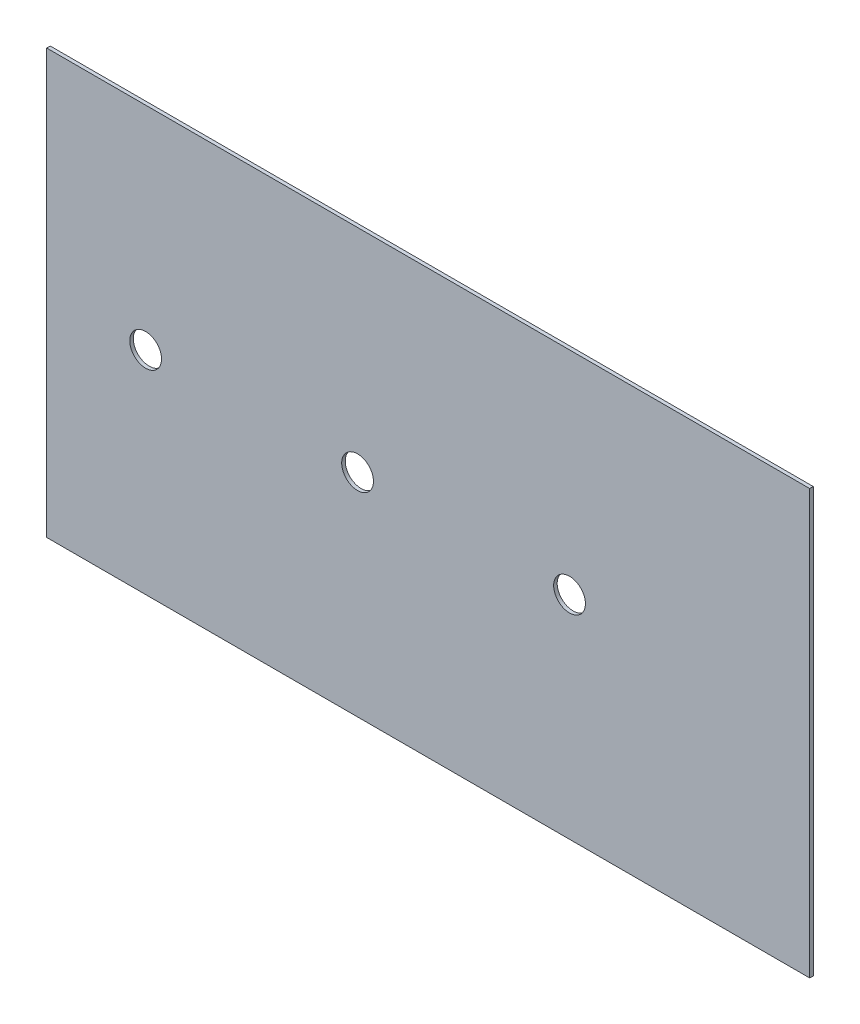
ISO-10303-21;
HEADER;
FILE_DESCRIPTION(('STEP AP214'),'2;1');
FILE_NAME('part.step','',(''),(''),'','','');
FILE_SCHEMA(('AUTOMOTIVE_DESIGN { 1 0 10303 214 1 1 1 1 }'));
ENDSEC;
DATA;
#1=APPLICATION_CONTEXT('core data for automotive mechanical design processes');
#2=APPLICATION_PROTOCOL_DEFINITION('international standard','automotive_design',2000,#1);
#3=PRODUCT_CONTEXT('',#1,'mechanical');
#4=PRODUCT('Part','Part','',(#3));
#5=PRODUCT_RELATED_PRODUCT_CATEGORY('part','',(#4));
#6=PRODUCT_DEFINITION_FORMATION('','',#4);
#7=PRODUCT_DEFINITION_CONTEXT('part definition',#1,'design');
#8=PRODUCT_DEFINITION('design','',#6,#7);
#9=PRODUCT_DEFINITION_SHAPE('','',#8);
#10=(LENGTH_UNIT() NAMED_UNIT(*) SI_UNIT(.MILLI.,.METRE.));
#11=(NAMED_UNIT(*) PLANE_ANGLE_UNIT() SI_UNIT($,.RADIAN.));
#12=(NAMED_UNIT(*) SI_UNIT($,.STERADIAN.) SOLID_ANGLE_UNIT());
#13=UNCERTAINTY_MEASURE_WITH_UNIT(LENGTH_MEASURE(1.E-05),#10,'distance_accuracy_value','');
#14=(GEOMETRIC_REPRESENTATION_CONTEXT(3) GLOBAL_UNCERTAINTY_ASSIGNED_CONTEXT((#13)) GLOBAL_UNIT_ASSIGNED_CONTEXT((#10,
#11,#12)) REPRESENTATION_CONTEXT('',''));
#15=CARTESIAN_POINT('',(0.,0.,0.));
#16=DIRECTION('',(0.,0.,1.));
#17=DIRECTION('',(1.,0.,0.));
#18=AXIS2_PLACEMENT_3D('',#15,#16,#17);
#19=CARTESIAN_POINT('',(0.,0.,3.175));
#20=DIRECTION('',(1.,0.,0.));
#21=DIRECTION('',(0.,0.,-1.));
#22=AXIS2_PLACEMENT_3D('',#19,#20,#21);
#23=PLANE('',#22);
#24=DIRECTION('',(0.,-1.,0.));
#25=VECTOR('',#24,1.);
#26=CARTESIAN_POINT('',(0.,0.,0.));
#27=LINE('',#26,#25);
#28=CARTESIAN_POINT('',(0.,381.,0.));
#29=VERTEX_POINT('',#28);
#30=CARTESIAN_POINT('',(0.,0.,0.));
#31=VERTEX_POINT('',#30);
#32=EDGE_CURVE('E106',#29,#31,#27,.T.);
#33=ORIENTED_EDGE('',*,*,#32,.T.);
#34=DIRECTION('',(0.,0.,-1.));
#35=VECTOR('',#34,1.);
#36=CARTESIAN_POINT('',(0.,0.,3.175));
#37=LINE('',#36,#35);
#38=CARTESIAN_POINT('',(0.,0.,3.175));
#39=VERTEX_POINT('',#38);
#40=EDGE_CURVE('E11',#39,#31,#37,.T.);
#41=ORIENTED_EDGE('',*,*,#40,.F.);
#42=DIRECTION('',(0.,-1.,0.));
#43=VECTOR('',#42,1.);
#44=CARTESIAN_POINT('',(0.,0.,3.175));
#45=LINE('',#44,#43);
#46=CARTESIAN_POINT('',(0.,381.,3.175));
#47=VERTEX_POINT('',#46);
#48=EDGE_CURVE('E90',#47,#39,#45,.T.);
#49=ORIENTED_EDGE('',*,*,#48,.F.);
#50=DIRECTION('',(0.,0.,-1.));
#51=VECTOR('',#50,1.);
#52=CARTESIAN_POINT('',(0.,381.,3.175));
#53=LINE('',#52,#51);
#54=EDGE_CURVE('E102',#47,#29,#53,.T.);
#55=ORIENTED_EDGE('',*,*,#54,.T.);
#56=EDGE_LOOP('',(#33,#41,#49,#55));
#57=FACE_BOUND('',#56,.T.);
#58=ADVANCED_FACE('F38',(#57),#23,.F.);
#59=CARTESIAN_POINT('',(0.,0.,3.175));
#60=DIRECTION('',(0.,1.,0.));
#61=DIRECTION('',(0.,0.,1.));
#62=AXIS2_PLACEMENT_3D('',#59,#60,#61);
#63=PLANE('',#62);
#64=DIRECTION('',(1.,0.,0.));
#65=VECTOR('',#64,1.);
#66=CARTESIAN_POINT('',(0.,0.,0.));
#67=LINE('',#66,#65);
#68=CARTESIAN_POINT('',(685.8,0.,0.));
#69=VERTEX_POINT('',#68);
#70=EDGE_CURVE('E95',#31,#69,#67,.T.);
#71=ORIENTED_EDGE('',*,*,#70,.T.);
#72=DIRECTION('',(0.,0.,-1.));
#73=VECTOR('',#72,1.);
#74=CARTESIAN_POINT('',(685.8,0.,3.175));
#75=LINE('',#74,#73);
#76=CARTESIAN_POINT('',(685.8,0.,3.175));
#77=VERTEX_POINT('',#76);
#78=EDGE_CURVE('E47',#77,#69,#75,.T.);
#79=ORIENTED_EDGE('',*,*,#78,.F.);
#80=DIRECTION('',(1.,0.,0.));
#81=VECTOR('',#80,1.);
#82=CARTESIAN_POINT('',(0.,0.,3.175));
#83=LINE('',#82,#81);
#84=EDGE_CURVE('E85',#39,#77,#83,.T.);
#85=ORIENTED_EDGE('',*,*,#84,.F.);
#86=ORIENTED_EDGE('',*,*,#40,.T.);
#87=EDGE_LOOP('',(#71,#79,#85,#86));
#88=FACE_BOUND('',#87,.T.);
#89=ADVANCED_FACE('F94',(#88),#63,.F.);
#90=CARTESIAN_POINT('',(685.8,0.,3.175));
#91=DIRECTION('',(-1.,0.,0.));
#92=DIRECTION('',(0.,0.,1.));
#93=AXIS2_PLACEMENT_3D('',#90,#91,#92);
#94=PLANE('',#93);
#95=DIRECTION('',(0.,1.,0.));
#96=VECTOR('',#95,1.);
#97=CARTESIAN_POINT('',(685.8,0.,0.));
#98=LINE('',#97,#96);
#99=CARTESIAN_POINT('',(685.8,381.,0.));
#100=VERTEX_POINT('',#99);
#101=EDGE_CURVE('E72',#69,#100,#98,.T.);
#102=ORIENTED_EDGE('',*,*,#101,.T.);
#103=DIRECTION('',(0.,0.,-1.));
#104=VECTOR('',#103,1.);
#105=CARTESIAN_POINT('',(685.8,381.,3.175));
#106=LINE('',#105,#104);
#107=CARTESIAN_POINT('',(685.8,381.,3.175));
#108=VERTEX_POINT('',#107);
#109=EDGE_CURVE('E97',#108,#100,#106,.T.);
#110=ORIENTED_EDGE('',*,*,#109,.F.);
#111=DIRECTION('',(0.,1.,0.));
#112=VECTOR('',#111,1.);
#113=CARTESIAN_POINT('',(685.8,0.,3.175));
#114=LINE('',#113,#112);
#115=EDGE_CURVE('E88',#77,#108,#114,.T.);
#116=ORIENTED_EDGE('',*,*,#115,.F.);
#117=ORIENTED_EDGE('',*,*,#78,.T.);
#118=EDGE_LOOP('',(#102,#110,#116,#117));
#119=FACE_BOUND('',#118,.T.);
#120=ADVANCED_FACE('F98',(#119),#94,.F.);
#121=CARTESIAN_POINT('',(0.,381.,3.175));
#122=DIRECTION('',(0.,-1.,0.));
#123=DIRECTION('',(0.,0.,-1.));
#124=AXIS2_PLACEMENT_3D('',#121,#122,#123);
#125=PLANE('',#124);
#126=DIRECTION('',(-1.,0.,0.));
#127=VECTOR('',#126,1.);
#128=CARTESIAN_POINT('',(0.,381.,0.));
#129=LINE('',#128,#127);
#130=EDGE_CURVE('E78',#100,#29,#129,.T.);
#131=ORIENTED_EDGE('',*,*,#130,.T.);
#132=ORIENTED_EDGE('',*,*,#54,.F.);
#133=DIRECTION('',(-1.,0.,0.));
#134=VECTOR('',#133,1.);
#135=CARTESIAN_POINT('',(0.,381.,3.175));
#136=LINE('',#135,#134);
#137=EDGE_CURVE('E55',#108,#47,#136,.T.);
#138=ORIENTED_EDGE('',*,*,#137,.F.);
#139=ORIENTED_EDGE('',*,*,#109,.T.);
#140=EDGE_LOOP('',(#131,#132,#138,#139));
#141=FACE_BOUND('',#140,.T.);
#142=ADVANCED_FACE('F120',(#141),#125,.F.);
#143=CARTESIAN_POINT('',(0.,0.,3.175));
#144=DIRECTION('',(0.,0.,-1.));
#145=DIRECTION('',(-1.,0.,0.));
#146=AXIS2_PLACEMENT_3D('',#143,#144,#145);
#147=PLANE('',#146);
#148=CARTESIAN_POINT('',(88.9,190.5,3.175));
#149=DIRECTION('',(0.,0.,1.));
#150=DIRECTION('',(1.,0.,0.));
#151=AXIS2_PLACEMENT_3D('',#148,#149,#150);
#152=CIRCLE('',#151,14.2875);
#153=CARTESIAN_POINT('',(103.1875,190.5,3.175));
#154=VERTEX_POINT('',#153);
#155=EDGE_CURVE('E143',#154,#154,#152,.T.);
#156=ORIENTED_EDGE('',*,*,#155,.F.);
#157=EDGE_LOOP('',(#156));
#158=FACE_BOUND('',#157,.T.);
#159=CARTESIAN_POINT('',(279.4,190.5,3.175));
#160=DIRECTION('',(0.,0.,1.));
#161=DIRECTION('',(1.,0.,0.));
#162=AXIS2_PLACEMENT_3D('',#159,#160,#161);
#163=CIRCLE('',#162,14.2875);
#164=CARTESIAN_POINT('',(293.6875,190.5,3.175));
#165=VERTEX_POINT('',#164);
#166=EDGE_CURVE('E139',#165,#165,#163,.T.);
#167=ORIENTED_EDGE('',*,*,#166,.F.);
#168=EDGE_LOOP('',(#167));
#169=FACE_BOUND('',#168,.T.);
#170=CARTESIAN_POINT('',(469.9,190.5,3.175));
#171=DIRECTION('',(0.,0.,1.));
#172=DIRECTION('',(1.,0.,0.));
#173=AXIS2_PLACEMENT_3D('',#170,#171,#172);
#174=CIRCLE('',#173,14.2875);
#175=CARTESIAN_POINT('',(484.1875,190.5,3.175));
#176=VERTEX_POINT('',#175);
#177=EDGE_CURVE('E131',#176,#176,#174,.T.);
#178=ORIENTED_EDGE('',*,*,#177,.F.);
#179=EDGE_LOOP('',(#178));
#180=FACE_BOUND('',#179,.T.);
#181=ORIENTED_EDGE('',*,*,#48,.T.);
#182=ORIENTED_EDGE('',*,*,#84,.T.);
#183=ORIENTED_EDGE('',*,*,#115,.T.);
#184=ORIENTED_EDGE('',*,*,#137,.T.);
#185=EDGE_LOOP('',(#181,#182,#183,#184));
#186=FACE_BOUND('',#185,.T.);
#187=ADVANCED_FACE('F86',(#158,#169,#180,#186),#147,.F.);
#188=CARTESIAN_POINT('',(0.,0.,0.));
#189=DIRECTION('',(0.,0.,-1.));
#190=DIRECTION('',(-1.,0.,0.));
#191=AXIS2_PLACEMENT_3D('',#188,#189,#190);
#192=PLANE('',#191);
#193=CARTESIAN_POINT('',(88.9,190.5,0.));
#194=DIRECTION('',(0.,0.,1.));
#195=DIRECTION('',(1.,0.,0.));
#196=AXIS2_PLACEMENT_3D('',#193,#194,#195);
#197=CIRCLE('',#196,14.2875);
#198=CARTESIAN_POINT('',(103.1875,190.5,0.));
#199=VERTEX_POINT('',#198);
#200=EDGE_CURVE('E110',#199,#199,#197,.T.);
#201=ORIENTED_EDGE('',*,*,#200,.T.);
#202=EDGE_LOOP('',(#201));
#203=FACE_BOUND('',#202,.T.);
#204=CARTESIAN_POINT('',(279.4,190.5,0.));
#205=DIRECTION('',(0.,0.,1.));
#206=DIRECTION('',(1.,0.,0.));
#207=AXIS2_PLACEMENT_3D('',#204,#205,#206);
#208=CIRCLE('',#207,14.2875);
#209=CARTESIAN_POINT('',(293.6875,190.5,0.));
#210=VERTEX_POINT('',#209);
#211=EDGE_CURVE('E135',#210,#210,#208,.T.);
#212=ORIENTED_EDGE('',*,*,#211,.T.);
#213=EDGE_LOOP('',(#212));
#214=FACE_BOUND('',#213,.T.);
#215=CARTESIAN_POINT('',(469.9,190.5,0.));
#216=DIRECTION('',(0.,0.,1.));
#217=DIRECTION('',(1.,0.,0.));
#218=AXIS2_PLACEMENT_3D('',#215,#216,#217);
#219=CIRCLE('',#218,14.2875);
#220=CARTESIAN_POINT('',(484.1875,190.5,0.));
#221=VERTEX_POINT('',#220);
#222=EDGE_CURVE('E127',#221,#221,#219,.T.);
#223=ORIENTED_EDGE('',*,*,#222,.T.);
#224=EDGE_LOOP('',(#223));
#225=FACE_BOUND('',#224,.T.);
#226=ORIENTED_EDGE('',*,*,#32,.F.);
#227=ORIENTED_EDGE('',*,*,#130,.F.);
#228=ORIENTED_EDGE('',*,*,#101,.F.);
#229=ORIENTED_EDGE('',*,*,#70,.F.);
#230=EDGE_LOOP('',(#226,#227,#228,#229));
#231=FACE_BOUND('',#230,.T.);
#232=ADVANCED_FACE('F123',(#203,#214,#225,#231),#192,.T.);
#233=CARTESIAN_POINT('',(469.9,190.5,0.));
#234=DIRECTION('',(0.,0.,1.));
#235=DIRECTION('',(1.,0.,0.));
#236=AXIS2_PLACEMENT_3D('',#233,#234,#235);
#237=CYLINDRICAL_SURFACE('',#236,14.2875);
#238=ORIENTED_EDGE('',*,*,#222,.F.);
#239=EDGE_LOOP('',(#238));
#240=FACE_BOUND('',#239,.T.);
#241=ORIENTED_EDGE('',*,*,#177,.T.);
#242=EDGE_LOOP('',(#241));
#243=FACE_BOUND('',#242,.T.);
#244=ADVANCED_FACE('F167',(#240,#243),#237,.F.);
#245=CARTESIAN_POINT('',(279.4,190.5,0.));
#246=DIRECTION('',(0.,0.,1.));
#247=DIRECTION('',(1.,0.,0.));
#248=AXIS2_PLACEMENT_3D('',#245,#246,#247);
#249=CYLINDRICAL_SURFACE('',#248,14.2875);
#250=ORIENTED_EDGE('',*,*,#211,.F.);
#251=EDGE_LOOP('',(#250));
#252=FACE_BOUND('',#251,.T.);
#253=ORIENTED_EDGE('',*,*,#166,.T.);
#254=EDGE_LOOP('',(#253));
#255=FACE_BOUND('',#254,.T.);
#256=ADVANCED_FACE('F156',(#252,#255),#249,.F.);
#257=CARTESIAN_POINT('',(88.9,190.5,0.));
#258=DIRECTION('',(0.,0.,1.));
#259=DIRECTION('',(1.,0.,0.));
#260=AXIS2_PLACEMENT_3D('',#257,#258,#259);
#261=CYLINDRICAL_SURFACE('',#260,14.2875);
#262=ORIENTED_EDGE('',*,*,#200,.F.);
#263=EDGE_LOOP('',(#262));
#264=FACE_BOUND('',#263,.T.);
#265=ORIENTED_EDGE('',*,*,#155,.T.);
#266=EDGE_LOOP('',(#265));
#267=FACE_BOUND('',#266,.T.);
#268=ADVANCED_FACE('F153',(#264,#267),#261,.F.);
#269=CLOSED_SHELL('',(#58,#89,#120,#142,#187,#232,#244,#256,#268));
#270=MANIFOLD_SOLID_BREP('B2',#269);
#271=ADVANCED_BREP_SHAPE_REPRESENTATION('',(#18,#270),#14);
#272=SHAPE_DEFINITION_REPRESENTATION(#9,#271);
ENDSEC;
END-ISO-10303-21;
